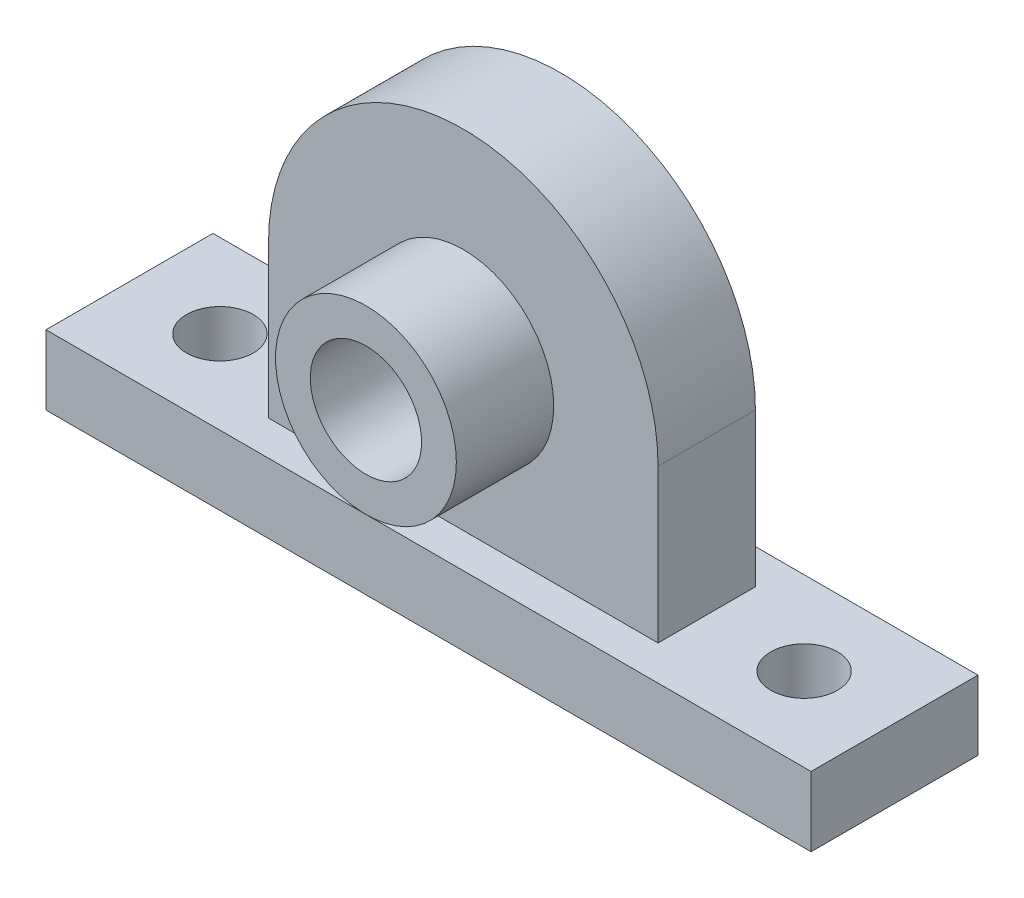
ISO-10303-21;
HEADER;
FILE_DESCRIPTION(('STEP AP214'),'2;1');
FILE_NAME('part.step','',(''),(''),'','','');
FILE_SCHEMA(('AUTOMOTIVE_DESIGN { 1 0 10303 214 1 1 1 1 }'));
ENDSEC;
DATA;
#1=APPLICATION_CONTEXT('core data for automotive mechanical design processes');
#2=APPLICATION_PROTOCOL_DEFINITION('international standard','automotive_design',2000,#1);
#3=PRODUCT_CONTEXT('',#1,'mechanical');
#4=PRODUCT('Part','Part','',(#3));
#5=PRODUCT_RELATED_PRODUCT_CATEGORY('part','',(#4));
#6=PRODUCT_DEFINITION_FORMATION('','',#4);
#7=PRODUCT_DEFINITION_CONTEXT('part definition',#1,'design');
#8=PRODUCT_DEFINITION('design','',#6,#7);
#9=PRODUCT_DEFINITION_SHAPE('','',#8);
#10=(LENGTH_UNIT() NAMED_UNIT(*) SI_UNIT(.MILLI.,.METRE.));
#11=(NAMED_UNIT(*) PLANE_ANGLE_UNIT() SI_UNIT($,.RADIAN.));
#12=(NAMED_UNIT(*) SI_UNIT($,.STERADIAN.) SOLID_ANGLE_UNIT());
#13=UNCERTAINTY_MEASURE_WITH_UNIT(LENGTH_MEASURE(1.E-05),#10,'distance_accuracy_value','');
#14=(GEOMETRIC_REPRESENTATION_CONTEXT(3) GLOBAL_UNCERTAINTY_ASSIGNED_CONTEXT((#13)) GLOBAL_UNIT_ASSIGNED_CONTEXT((#10,
#11,#12)) REPRESENTATION_CONTEXT('',''));
#15=CARTESIAN_POINT('',(0.,0.,0.));
#16=DIRECTION('',(0.,0.,1.));
#17=DIRECTION('',(1.,0.,0.));
#18=AXIS2_PLACEMENT_3D('',#15,#16,#17);
#19=CARTESIAN_POINT('',(0.,2.5,6.));
#20=DIRECTION('',(0.,1.,0.));
#21=DIRECTION('',(0.,0.,1.));
#22=AXIS2_PLACEMENT_3D('',#19,#20,#21);
#23=PLANE('',#22);
#24=CARTESIAN_POINT('',(21.,2.5,0.));
#25=DIRECTION('',(0.,1.,0.));
#26=DIRECTION('',(0.,0.,1.));
#27=AXIS2_PLACEMENT_3D('',#24,#25,#26);
#28=CIRCLE('',#27,2.4);
#29=CARTESIAN_POINT('',(21.,2.5,2.4));
#30=VERTEX_POINT('',#29);
#31=EDGE_CURVE('E226',#30,#30,#28,.F.);
#32=ORIENTED_EDGE('',*,*,#31,.T.);
#33=EDGE_LOOP('',(#32));
#34=FACE_BOUND('',#33,.T.);
#35=CARTESIAN_POINT('',(-21.,2.5,0.));
#36=DIRECTION('',(0.,1.,0.));
#37=DIRECTION('',(0.,0.,1.));
#38=AXIS2_PLACEMENT_3D('',#35,#36,#37);
#39=CIRCLE('',#38,2.4);
#40=CARTESIAN_POINT('',(-21.,2.5,2.4));
#41=VERTEX_POINT('',#40);
#42=EDGE_CURVE('E240',#41,#41,#39,.F.);
#43=ORIENTED_EDGE('',*,*,#42,.T.);
#44=EDGE_LOOP('',(#43));
#45=FACE_BOUND('',#44,.T.);
#46=DIRECTION('',(1.,0.,0.));
#47=VECTOR('',#46,1.);
#48=CARTESIAN_POINT('',(0.,2.5,-6.));
#49=LINE('',#48,#47);
#50=CARTESIAN_POINT('',(-27.5,2.5,-6.));
#51=VERTEX_POINT('',#50);
#52=CARTESIAN_POINT('',(27.5,2.5,-6.));
#53=VERTEX_POINT('',#52);
#54=EDGE_CURVE('E133',#51,#53,#49,.T.);
#55=ORIENTED_EDGE('',*,*,#54,.F.);
#56=DIRECTION('',(0.,0.,-1.));
#57=VECTOR('',#56,1.);
#58=CARTESIAN_POINT('',(-27.5,2.5,6.));
#59=LINE('',#58,#57);
#60=CARTESIAN_POINT('',(-27.5,2.5,6.));
#61=VERTEX_POINT('',#60);
#62=EDGE_CURVE('E45',#61,#51,#59,.T.);
#63=ORIENTED_EDGE('',*,*,#62,.F.);
#64=DIRECTION('',(1.,0.,0.));
#65=VECTOR('',#64,1.);
#66=CARTESIAN_POINT('',(0.,2.5,6.));
#67=LINE('',#66,#65);
#68=CARTESIAN_POINT('',(27.5,2.5,6.));
#69=VERTEX_POINT('',#68);
#70=EDGE_CURVE('E141',#61,#69,#67,.T.);
#71=ORIENTED_EDGE('',*,*,#70,.T.);
#72=DIRECTION('',(0.,0.,-1.));
#73=VECTOR('',#72,1.);
#74=CARTESIAN_POINT('',(27.5,2.5,6.));
#75=LINE('',#74,#73);
#76=EDGE_CURVE('E11',#69,#53,#75,.T.);
#77=ORIENTED_EDGE('',*,*,#76,.T.);
#78=EDGE_LOOP('',(#55,#63,#71,#77));
#79=FACE_BOUND('',#78,.T.);
#80=DIRECTION('',(0.,0.,-1.));
#81=VECTOR('',#80,1.);
#82=CARTESIAN_POINT('',(-14.,2.5,3.5));
#83=LINE('',#82,#81);
#84=CARTESIAN_POINT('',(-14.,2.5,3.5));
#85=VERTEX_POINT('',#84);
#86=CARTESIAN_POINT('',(-14.,2.5,-3.5));
#87=VERTEX_POINT('',#86);
#88=EDGE_CURVE('E253',#85,#87,#83,.T.);
#89=ORIENTED_EDGE('',*,*,#88,.T.);
#90=DIRECTION('',(1.,0.,0.));
#91=VECTOR('',#90,1.);
#92=CARTESIAN_POINT('',(0.,2.5,-3.5));
#93=LINE('',#92,#91);
#94=CARTESIAN_POINT('',(14.,2.5,-3.5));
#95=VERTEX_POINT('',#94);
#96=EDGE_CURVE('E52',#87,#95,#93,.T.);
#97=ORIENTED_EDGE('',*,*,#96,.T.);
#98=DIRECTION('',(0.,0.,-1.));
#99=VECTOR('',#98,1.);
#100=CARTESIAN_POINT('',(14.,2.5,3.5));
#101=LINE('',#100,#99);
#102=CARTESIAN_POINT('',(14.,2.5,3.5));
#103=VERTEX_POINT('',#102);
#104=EDGE_CURVE('E125',#103,#95,#101,.T.);
#105=ORIENTED_EDGE('',*,*,#104,.F.);
#106=DIRECTION('',(1.,0.,0.));
#107=VECTOR('',#106,1.);
#108=CARTESIAN_POINT('',(0.,2.5,3.5));
#109=LINE('',#108,#107);
#110=EDGE_CURVE('E109',#85,#103,#109,.T.);
#111=ORIENTED_EDGE('',*,*,#110,.F.);
#112=EDGE_LOOP('',(#89,#97,#105,#111));
#113=FACE_BOUND('',#112,.T.);
#114=ADVANCED_FACE('F37',(#34,#45,#79,#113),#23,.T.);
#115=CARTESIAN_POINT('',(27.5,0.,6.));
#116=DIRECTION('',(1.,0.,0.));
#117=DIRECTION('',(0.,0.,-1.));
#118=AXIS2_PLACEMENT_3D('',#115,#116,#117);
#119=PLANE('',#118);
#120=DIRECTION('',(0.,-1.,0.));
#121=VECTOR('',#120,1.);
#122=CARTESIAN_POINT('',(27.5,0.,-6.));
#123=LINE('',#122,#121);
#124=CARTESIAN_POINT('',(27.5,-2.5,-6.));
#125=VERTEX_POINT('',#124);
#126=EDGE_CURVE('E130',#53,#125,#123,.T.);
#127=ORIENTED_EDGE('',*,*,#126,.F.);
#128=ORIENTED_EDGE('',*,*,#76,.F.);
#129=DIRECTION('',(0.,-1.,0.));
#130=VECTOR('',#129,1.);
#131=CARTESIAN_POINT('',(27.5,0.,6.));
#132=LINE('',#131,#130);
#133=CARTESIAN_POINT('',(27.5,-2.5,6.));
#134=VERTEX_POINT('',#133);
#135=EDGE_CURVE('E139',#69,#134,#132,.T.);
#136=ORIENTED_EDGE('',*,*,#135,.T.);
#137=DIRECTION('',(0.,0.,-1.));
#138=VECTOR('',#137,1.);
#139=CARTESIAN_POINT('',(27.5,-2.5,6.));
#140=LINE('',#139,#138);
#141=EDGE_CURVE('E81',#134,#125,#140,.T.);
#142=ORIENTED_EDGE('',*,*,#141,.T.);
#143=EDGE_LOOP('',(#127,#128,#136,#142));
#144=FACE_BOUND('',#143,.T.);
#145=ADVANCED_FACE('F39',(#144),#119,.T.);
#146=CARTESIAN_POINT('',(-27.5,0.,6.));
#147=DIRECTION('',(1.,0.,0.));
#148=DIRECTION('',(0.,0.,-1.));
#149=AXIS2_PLACEMENT_3D('',#146,#147,#148);
#150=PLANE('',#149);
#151=DIRECTION('',(0.,-1.,0.));
#152=VECTOR('',#151,1.);
#153=CARTESIAN_POINT('',(-27.5,0.,-6.));
#154=LINE('',#153,#152);
#155=CARTESIAN_POINT('',(-27.5,-2.5,-6.));
#156=VERTEX_POINT('',#155);
#157=EDGE_CURVE('E150',#51,#156,#154,.T.);
#158=ORIENTED_EDGE('',*,*,#157,.T.);
#159=DIRECTION('',(0.,0.,-1.));
#160=VECTOR('',#159,1.);
#161=CARTESIAN_POINT('',(-27.5,-2.5,6.));
#162=LINE('',#161,#160);
#163=CARTESIAN_POINT('',(-27.5,-2.5,6.));
#164=VERTEX_POINT('',#163);
#165=EDGE_CURVE('E154',#164,#156,#162,.T.);
#166=ORIENTED_EDGE('',*,*,#165,.F.);
#167=DIRECTION('',(0.,-1.,0.));
#168=VECTOR('',#167,1.);
#169=CARTESIAN_POINT('',(-27.5,0.,6.));
#170=LINE('',#169,#168);
#171=EDGE_CURVE('E145',#61,#164,#170,.T.);
#172=ORIENTED_EDGE('',*,*,#171,.F.);
#173=ORIENTED_EDGE('',*,*,#62,.T.);
#174=EDGE_LOOP('',(#158,#166,#172,#173));
#175=FACE_BOUND('',#174,.T.);
#176=ADVANCED_FACE('F159',(#175),#150,.F.);
#177=CARTESIAN_POINT('',(0.,-2.5,6.));
#178=DIRECTION('',(0.,1.,0.));
#179=DIRECTION('',(0.,0.,1.));
#180=AXIS2_PLACEMENT_3D('',#177,#178,#179);
#181=PLANE('',#180);
#182=CARTESIAN_POINT('',(21.,-2.5,0.));
#183=DIRECTION('',(0.,-1.,0.));
#184=DIRECTION('',(0.,0.,-1.));
#185=AXIS2_PLACEMENT_3D('',#182,#183,#184);
#186=CIRCLE('',#185,2.4);
#187=CARTESIAN_POINT('',(21.,-2.5,-2.4));
#188=VERTEX_POINT('',#187);
#189=EDGE_CURVE('E229',#188,#188,#186,.T.);
#190=ORIENTED_EDGE('',*,*,#189,.F.);
#191=EDGE_LOOP('',(#190));
#192=FACE_BOUND('',#191,.T.);
#193=CARTESIAN_POINT('',(-21.,-2.5,0.));
#194=DIRECTION('',(0.,-1.,0.));
#195=DIRECTION('',(0.,0.,-1.));
#196=AXIS2_PLACEMENT_3D('',#193,#194,#195);
#197=CIRCLE('',#196,2.4);
#198=CARTESIAN_POINT('',(-21.,-2.5,-2.4));
#199=VERTEX_POINT('',#198);
#200=EDGE_CURVE('E235',#199,#199,#197,.T.);
#201=ORIENTED_EDGE('',*,*,#200,.F.);
#202=EDGE_LOOP('',(#201));
#203=FACE_BOUND('',#202,.T.);
#204=DIRECTION('',(1.,0.,0.));
#205=VECTOR('',#204,1.);
#206=CARTESIAN_POINT('',(0.,-2.5,-6.));
#207=LINE('',#206,#205);
#208=EDGE_CURVE('E142',#156,#125,#207,.T.);
#209=ORIENTED_EDGE('',*,*,#208,.T.);
#210=ORIENTED_EDGE('',*,*,#141,.F.);
#211=DIRECTION('',(1.,0.,0.));
#212=VECTOR('',#211,1.);
#213=CARTESIAN_POINT('',(0.,-2.5,6.));
#214=LINE('',#213,#212);
#215=EDGE_CURVE('E61',#164,#134,#214,.T.);
#216=ORIENTED_EDGE('',*,*,#215,.F.);
#217=ORIENTED_EDGE('',*,*,#165,.T.);
#218=EDGE_LOOP('',(#209,#210,#216,#217));
#219=FACE_BOUND('',#218,.T.);
#220=ADVANCED_FACE('F172',(#192,#203,#219),#181,.F.);
#221=CARTESIAN_POINT('',(0.,0.,6.));
#222=DIRECTION('',(0.,0.,1.));
#223=DIRECTION('',(1.,0.,0.));
#224=AXIS2_PLACEMENT_3D('',#221,#222,#223);
#225=PLANE('',#224);
#226=ORIENTED_EDGE('',*,*,#135,.F.);
#227=ORIENTED_EDGE('',*,*,#70,.F.);
#228=ORIENTED_EDGE('',*,*,#171,.T.);
#229=ORIENTED_EDGE('',*,*,#215,.T.);
#230=EDGE_LOOP('',(#226,#227,#228,#229));
#231=FACE_BOUND('',#230,.T.);
#232=ADVANCED_FACE('F182',(#231),#225,.T.);
#233=CARTESIAN_POINT('',(0.,0.,-6.));
#234=DIRECTION('',(0.,0.,1.));
#235=DIRECTION('',(1.,0.,0.));
#236=AXIS2_PLACEMENT_3D('',#233,#234,#235);
#237=PLANE('',#236);
#238=ORIENTED_EDGE('',*,*,#126,.T.);
#239=ORIENTED_EDGE('',*,*,#208,.F.);
#240=ORIENTED_EDGE('',*,*,#157,.F.);
#241=ORIENTED_EDGE('',*,*,#54,.T.);
#242=EDGE_LOOP('',(#238,#239,#240,#241));
#243=FACE_BOUND('',#242,.T.);
#244=ADVANCED_FACE('F166',(#243),#237,.F.);
#245=CARTESIAN_POINT('',(14.,0.,3.5));
#246=DIRECTION('',(1.,0.,0.));
#247=DIRECTION('',(0.,1.,0.));
#248=AXIS2_PLACEMENT_3D('',#245,#246,#247);
#249=PLANE('',#248);
#250=DIRECTION('',(0.,-1.,0.));
#251=VECTOR('',#250,1.);
#252=CARTESIAN_POINT('',(14.,0.,-3.5));
#253=LINE('',#252,#251);
#254=CARTESIAN_POINT('',(14.,13.5,-3.5));
#255=VERTEX_POINT('',#254);
#256=EDGE_CURVE('E255',#255,#95,#253,.T.);
#257=ORIENTED_EDGE('',*,*,#256,.F.);
#258=DIRECTION('',(0.,0.,-1.));
#259=VECTOR('',#258,1.);
#260=CARTESIAN_POINT('',(14.,13.5,3.5));
#261=LINE('',#260,#259);
#262=CARTESIAN_POINT('',(14.,13.5,3.5));
#263=VERTEX_POINT('',#262);
#264=EDGE_CURVE('E126',#263,#255,#261,.T.);
#265=ORIENTED_EDGE('',*,*,#264,.F.);
#266=DIRECTION('',(0.,-1.,0.));
#267=VECTOR('',#266,1.);
#268=CARTESIAN_POINT('',(14.,0.,3.5));
#269=LINE('',#268,#267);
#270=EDGE_CURVE('E113',#263,#103,#269,.T.);
#271=ORIENTED_EDGE('',*,*,#270,.T.);
#272=ORIENTED_EDGE('',*,*,#104,.T.);
#273=EDGE_LOOP('',(#257,#265,#271,#272));
#274=FACE_BOUND('',#273,.T.);
#275=ADVANCED_FACE('F124',(#274),#249,.T.);
#276=CARTESIAN_POINT('',(0.,13.5,3.5));
#277=DIRECTION('',(0.,0.,-1.));
#278=DIRECTION('',(-1.,0.,0.));
#279=AXIS2_PLACEMENT_3D('',#276,#277,#278);
#280=CYLINDRICAL_SURFACE('',#279,14.);
#281=CARTESIAN_POINT('',(0.,13.5,-3.5));
#282=DIRECTION('',(0.,0.,1.));
#283=DIRECTION('',(1.,0.,0.));
#284=AXIS2_PLACEMENT_3D('',#281,#282,#283);
#285=CIRCLE('',#284,14.);
#286=CARTESIAN_POINT('',(-14.,13.5,-3.5));
#287=VERTEX_POINT('',#286);
#288=EDGE_CURVE('E257',#255,#287,#285,.T.);
#289=ORIENTED_EDGE('',*,*,#288,.T.);
#290=DIRECTION('',(0.,0.,-1.));
#291=VECTOR('',#290,1.);
#292=CARTESIAN_POINT('',(-14.,13.5,3.5));
#293=LINE('',#292,#291);
#294=CARTESIAN_POINT('',(-14.,13.5,3.5));
#295=VERTEX_POINT('',#294);
#296=EDGE_CURVE('E135',#295,#287,#293,.T.);
#297=ORIENTED_EDGE('',*,*,#296,.F.);
#298=CARTESIAN_POINT('',(0.,13.5,3.5));
#299=DIRECTION('',(0.,0.,1.));
#300=DIRECTION('',(1.,0.,0.));
#301=AXIS2_PLACEMENT_3D('',#298,#299,#300);
#302=CIRCLE('',#301,14.);
#303=EDGE_CURVE('E128',#263,#295,#302,.T.);
#304=ORIENTED_EDGE('',*,*,#303,.F.);
#305=ORIENTED_EDGE('',*,*,#264,.T.);
#306=EDGE_LOOP('',(#289,#297,#304,#305));
#307=FACE_BOUND('',#306,.T.);
#308=ADVANCED_FACE('F190',(#307),#280,.T.);
#309=CARTESIAN_POINT('',(-14.,0.,3.5));
#310=DIRECTION('',(1.,0.,0.));
#311=DIRECTION('',(0.,1.,0.));
#312=AXIS2_PLACEMENT_3D('',#309,#310,#311);
#313=PLANE('',#312);
#314=DIRECTION('',(0.,-1.,0.));
#315=VECTOR('',#314,1.);
#316=CARTESIAN_POINT('',(-14.,0.,-3.5));
#317=LINE('',#316,#315);
#318=EDGE_CURVE('E120',#287,#87,#317,.T.);
#319=ORIENTED_EDGE('',*,*,#318,.T.);
#320=ORIENTED_EDGE('',*,*,#88,.F.);
#321=DIRECTION('',(0.,-1.,0.));
#322=VECTOR('',#321,1.);
#323=CARTESIAN_POINT('',(-14.,0.,3.5));
#324=LINE('',#323,#322);
#325=EDGE_CURVE('E115',#295,#85,#324,.T.);
#326=ORIENTED_EDGE('',*,*,#325,.F.);
#327=ORIENTED_EDGE('',*,*,#296,.T.);
#328=EDGE_LOOP('',(#319,#320,#326,#327));
#329=FACE_BOUND('',#328,.T.);
#330=ADVANCED_FACE('F193',(#329),#313,.F.);
#331=CARTESIAN_POINT('',(0.,0.,3.5));
#332=DIRECTION('',(0.,0.,1.));
#333=DIRECTION('',(1.,0.,0.));
#334=AXIS2_PLACEMENT_3D('',#331,#332,#333);
#335=PLANE('',#334);
#336=ORIENTED_EDGE('',*,*,#110,.T.);
#337=ORIENTED_EDGE('',*,*,#270,.F.);
#338=ORIENTED_EDGE('',*,*,#303,.T.);
#339=ORIENTED_EDGE('',*,*,#325,.T.);
#340=EDGE_LOOP('',(#336,#337,#338,#339));
#341=FACE_BOUND('',#340,.T.);
#342=CARTESIAN_POINT('',(0.,13.5,3.5));
#343=DIRECTION('',(0.,0.,1.));
#344=DIRECTION('',(1.,0.,0.));
#345=AXIS2_PLACEMENT_3D('',#342,#343,#344);
#346=CIRCLE('',#345,6.5);
#347=CARTESIAN_POINT('',(6.5,13.5,3.5));
#348=VERTEX_POINT('',#347);
#349=EDGE_CURVE('E250',#348,#348,#346,.T.);
#350=ORIENTED_EDGE('',*,*,#349,.F.);
#351=EDGE_LOOP('',(#350));
#352=FACE_BOUND('',#351,.T.);
#353=ADVANCED_FACE('F111',(#341,#352),#335,.T.);
#354=CARTESIAN_POINT('',(0.,0.,-3.5));
#355=DIRECTION('',(0.,0.,1.));
#356=DIRECTION('',(1.,0.,0.));
#357=AXIS2_PLACEMENT_3D('',#354,#355,#356);
#358=PLANE('',#357);
#359=ORIENTED_EDGE('',*,*,#96,.F.);
#360=ORIENTED_EDGE('',*,*,#318,.F.);
#361=ORIENTED_EDGE('',*,*,#288,.F.);
#362=ORIENTED_EDGE('',*,*,#256,.T.);
#363=EDGE_LOOP('',(#359,#360,#361,#362));
#364=FACE_BOUND('',#363,.T.);
#365=CARTESIAN_POINT('',(0.,13.5,-3.5));
#366=DIRECTION('',(0.,0.,1.));
#367=DIRECTION('',(1.,0.,0.));
#368=AXIS2_PLACEMENT_3D('',#365,#366,#367);
#369=CIRCLE('',#368,4.);
#370=CARTESIAN_POINT('',(4.,13.5,-3.5));
#371=VERTEX_POINT('',#370);
#372=EDGE_CURVE('E245',#371,#371,#369,.T.);
#373=ORIENTED_EDGE('',*,*,#372,.T.);
#374=EDGE_LOOP('',(#373));
#375=FACE_BOUND('',#374,.T.);
#376=ADVANCED_FACE('F198',(#364,#375),#358,.F.);
#377=CARTESIAN_POINT('',(0.,13.5,-3.5));
#378=DIRECTION('',(0.,0.,1.));
#379=DIRECTION('',(1.,0.,0.));
#380=AXIS2_PLACEMENT_3D('',#377,#378,#379);
#381=CYLINDRICAL_SURFACE('',#380,4.);
#382=ORIENTED_EDGE('',*,*,#372,.F.);
#383=EDGE_LOOP('',(#382));
#384=FACE_BOUND('',#383,.T.);
#385=CARTESIAN_POINT('',(0.,13.5,10.5));
#386=DIRECTION('',(0.,0.,1.));
#387=DIRECTION('',(1.,0.,0.));
#388=AXIS2_PLACEMENT_3D('',#385,#386,#387);
#389=CIRCLE('',#388,4.);
#390=CARTESIAN_POINT('',(4.,13.5,10.5));
#391=VERTEX_POINT('',#390);
#392=EDGE_CURVE('E230',#391,#391,#389,.T.);
#393=ORIENTED_EDGE('',*,*,#392,.T.);
#394=EDGE_LOOP('',(#393));
#395=FACE_BOUND('',#394,.T.);
#396=ADVANCED_FACE('F201',(#384,#395),#381,.F.);
#397=CARTESIAN_POINT('',(0.,13.5,-3.5));
#398=DIRECTION('',(0.,0.,1.));
#399=DIRECTION('',(1.,0.,0.));
#400=AXIS2_PLACEMENT_3D('',#397,#398,#399);
#401=CYLINDRICAL_SURFACE('',#400,6.5);
#402=ORIENTED_EDGE('',*,*,#349,.T.);
#403=EDGE_LOOP('',(#402));
#404=FACE_BOUND('',#403,.T.);
#405=CARTESIAN_POINT('',(0.,13.5,10.5));
#406=DIRECTION('',(0.,0.,1.));
#407=DIRECTION('',(1.,0.,0.));
#408=AXIS2_PLACEMENT_3D('',#405,#406,#407);
#409=CIRCLE('',#408,6.5);
#410=CARTESIAN_POINT('',(6.5,13.5,10.5));
#411=VERTEX_POINT('',#410);
#412=EDGE_CURVE('E233',#411,#411,#409,.T.);
#413=ORIENTED_EDGE('',*,*,#412,.F.);
#414=EDGE_LOOP('',(#413));
#415=FACE_BOUND('',#414,.T.);
#416=ADVANCED_FACE('F206',(#404,#415),#401,.T.);
#417=CARTESIAN_POINT('',(0.,0.,10.5));
#418=DIRECTION('',(0.,0.,1.));
#419=DIRECTION('',(1.,0.,0.));
#420=AXIS2_PLACEMENT_3D('',#417,#418,#419);
#421=PLANE('',#420);
#422=ORIENTED_EDGE('',*,*,#392,.F.);
#423=EDGE_LOOP('',(#422));
#424=FACE_BOUND('',#423,.T.);
#425=ORIENTED_EDGE('',*,*,#412,.T.);
#426=EDGE_LOOP('',(#425));
#427=FACE_BOUND('',#426,.T.);
#428=ADVANCED_FACE('F210',(#424,#427),#421,.T.);
#429=CARTESIAN_POINT('',(-21.,27.501,0.));
#430=DIRECTION('',(0.,-1.,0.));
#431=DIRECTION('',(0.,0.,-1.));
#432=AXIS2_PLACEMENT_3D('',#429,#430,#431);
#433=CYLINDRICAL_SURFACE('',#432,2.4);
#434=ORIENTED_EDGE('',*,*,#42,.F.);
#435=EDGE_LOOP('',(#434));
#436=FACE_BOUND('',#435,.T.);
#437=ORIENTED_EDGE('',*,*,#200,.T.);
#438=EDGE_LOOP('',(#437));
#439=FACE_BOUND('',#438,.T.);
#440=ADVANCED_FACE('F214',(#436,#439),#433,.F.);
#441=CARTESIAN_POINT('',(21.,27.501,0.));
#442=DIRECTION('',(0.,-1.,0.));
#443=DIRECTION('',(0.,0.,-1.));
#444=AXIS2_PLACEMENT_3D('',#441,#442,#443);
#445=CYLINDRICAL_SURFACE('',#444,2.4);
#446=ORIENTED_EDGE('',*,*,#31,.F.);
#447=EDGE_LOOP('',(#446));
#448=FACE_BOUND('',#447,.T.);
#449=ORIENTED_EDGE('',*,*,#189,.T.);
#450=EDGE_LOOP('',(#449));
#451=FACE_BOUND('',#450,.T.);
#452=ADVANCED_FACE('F218',(#448,#451),#445,.F.);
#453=CLOSED_SHELL('',(#114,#145,#176,#220,#232,#244,#275,#308,#330,#353,#376,#396,#416,#428,
#440,#452));
#454=MANIFOLD_SOLID_BREP('B2',#453);
#455=ADVANCED_BREP_SHAPE_REPRESENTATION('',(#18,#454),#14);
#456=SHAPE_DEFINITION_REPRESENTATION(#9,#455);
ENDSEC;
END-ISO-10303-21;
